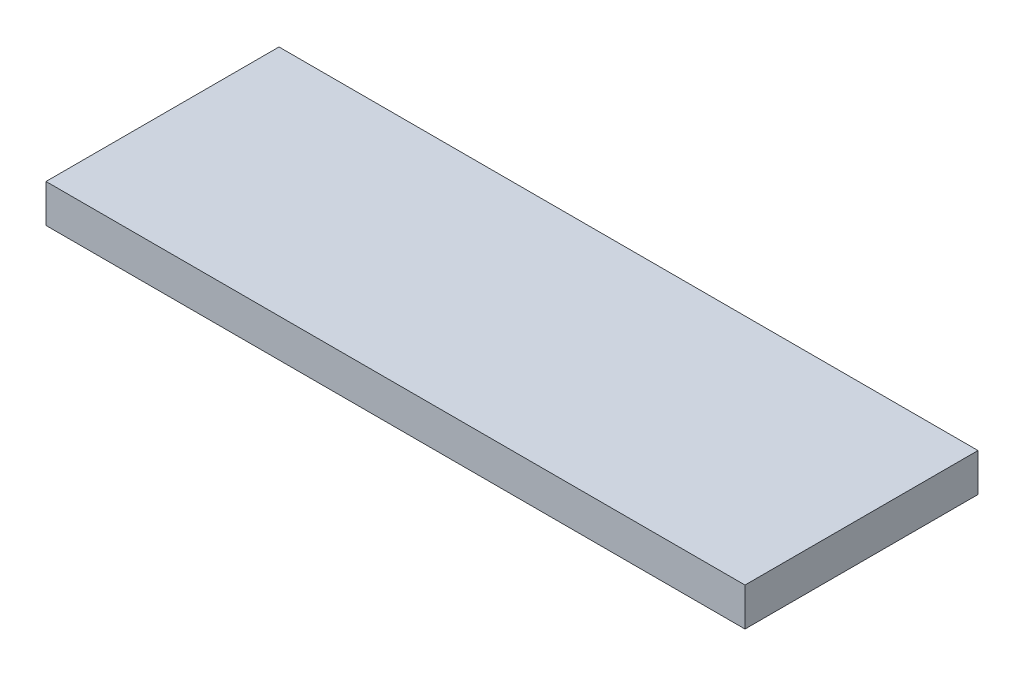
ISO-10303-21;
HEADER;
FILE_DESCRIPTION(('STEP AP214'),'2;1');
FILE_NAME('part.step','',(''),(''),'','','');
FILE_SCHEMA(('AUTOMOTIVE_DESIGN { 1 0 10303 214 1 1 1 1 }'));
ENDSEC;
DATA;
#1=APPLICATION_CONTEXT('core data for automotive mechanical design processes');
#2=APPLICATION_PROTOCOL_DEFINITION('international standard','automotive_design',2000,#1);
#3=PRODUCT_CONTEXT('',#1,'mechanical');
#4=PRODUCT('Part','Part','',(#3));
#5=PRODUCT_RELATED_PRODUCT_CATEGORY('part','',(#4));
#6=PRODUCT_DEFINITION_FORMATION('','',#4);
#7=PRODUCT_DEFINITION_CONTEXT('part definition',#1,'design');
#8=PRODUCT_DEFINITION('design','',#6,#7);
#9=PRODUCT_DEFINITION_SHAPE('','',#8);
#10=(LENGTH_UNIT() NAMED_UNIT(*) SI_UNIT(.MILLI.,.METRE.));
#11=(NAMED_UNIT(*) PLANE_ANGLE_UNIT() SI_UNIT($,.RADIAN.));
#12=(NAMED_UNIT(*) SI_UNIT($,.STERADIAN.) SOLID_ANGLE_UNIT());
#13=UNCERTAINTY_MEASURE_WITH_UNIT(LENGTH_MEASURE(1.E-05),#10,'distance_accuracy_value','');
#14=(GEOMETRIC_REPRESENTATION_CONTEXT(3) GLOBAL_UNCERTAINTY_ASSIGNED_CONTEXT((#13)) GLOBAL_UNIT_ASSIGNED_CONTEXT((#10,
#11,#12)) REPRESENTATION_CONTEXT('',''));
#15=CARTESIAN_POINT('',(0.,0.,0.));
#16=DIRECTION('',(0.,0.,1.));
#17=DIRECTION('',(1.,0.,0.));
#18=AXIS2_PLACEMENT_3D('',#15,#16,#17);
#19=CARTESIAN_POINT('',(82.5,9.,-27.5));
#20=DIRECTION('',(-1.,0.,0.));
#21=DIRECTION('',(0.,0.,1.));
#22=AXIS2_PLACEMENT_3D('',#19,#20,#21);
#23=PLANE('',#22);
#24=DIRECTION('',(0.,0.,-1.));
#25=VECTOR('',#24,1.);
#26=CARTESIAN_POINT('',(82.5,0.,-27.5));
#27=LINE('',#26,#25);
#28=CARTESIAN_POINT('',(82.5,0.,27.5));
#29=VERTEX_POINT('',#28);
#30=CARTESIAN_POINT('',(82.5,0.,-27.5));
#31=VERTEX_POINT('',#30);
#32=EDGE_CURVE('E95',#29,#31,#27,.T.);
#33=ORIENTED_EDGE('',*,*,#32,.T.);
#34=DIRECTION('',(0.,-1.,0.));
#35=VECTOR('',#34,1.);
#36=CARTESIAN_POINT('',(82.5,9.,-27.5));
#37=LINE('',#36,#35);
#38=CARTESIAN_POINT('',(82.5,9.,-27.5));
#39=VERTEX_POINT('',#38);
#40=EDGE_CURVE('E11',#39,#31,#37,.T.);
#41=ORIENTED_EDGE('',*,*,#40,.F.);
#42=DIRECTION('',(0.,0.,-1.));
#43=VECTOR('',#42,1.);
#44=CARTESIAN_POINT('',(82.5,9.,-27.5));
#45=LINE('',#44,#43);
#46=CARTESIAN_POINT('',(82.5,9.,27.5));
#47=VERTEX_POINT('',#46);
#48=EDGE_CURVE('E83',#47,#39,#45,.T.);
#49=ORIENTED_EDGE('',*,*,#48,.F.);
#50=DIRECTION('',(0.,-1.,0.));
#51=VECTOR('',#50,1.);
#52=CARTESIAN_POINT('',(82.5,9.,27.5));
#53=LINE('',#52,#51);
#54=EDGE_CURVE('E91',#47,#29,#53,.T.);
#55=ORIENTED_EDGE('',*,*,#54,.T.);
#56=EDGE_LOOP('',(#33,#41,#49,#55));
#57=FACE_BOUND('',#56,.T.);
#58=ADVANCED_FACE('F32',(#57),#23,.F.);
#59=CARTESIAN_POINT('',(-82.5,9.,-27.5));
#60=DIRECTION('',(0.,0.,1.));
#61=DIRECTION('',(1.,0.,0.));
#62=AXIS2_PLACEMENT_3D('',#59,#60,#61);
#63=PLANE('',#62);
#64=DIRECTION('',(-1.,0.,0.));
#65=VECTOR('',#64,1.);
#66=CARTESIAN_POINT('',(-82.5,0.,-27.5));
#67=LINE('',#66,#65);
#68=CARTESIAN_POINT('',(-82.5,0.,-27.5));
#69=VERTEX_POINT('',#68);
#70=EDGE_CURVE('E87',#31,#69,#67,.T.);
#71=ORIENTED_EDGE('',*,*,#70,.T.);
#72=DIRECTION('',(0.,-1.,0.));
#73=VECTOR('',#72,1.);
#74=CARTESIAN_POINT('',(-82.5,9.,-27.5));
#75=LINE('',#74,#73);
#76=CARTESIAN_POINT('',(-82.5,9.,-27.5));
#77=VERTEX_POINT('',#76);
#78=EDGE_CURVE('E40',#77,#69,#75,.T.);
#79=ORIENTED_EDGE('',*,*,#78,.F.);
#80=DIRECTION('',(-1.,0.,0.));
#81=VECTOR('',#80,1.);
#82=CARTESIAN_POINT('',(-82.5,9.,-27.5));
#83=LINE('',#82,#81);
#84=EDGE_CURVE('E78',#39,#77,#83,.T.);
#85=ORIENTED_EDGE('',*,*,#84,.F.);
#86=ORIENTED_EDGE('',*,*,#40,.T.);
#87=EDGE_LOOP('',(#71,#79,#85,#86));
#88=FACE_BOUND('',#87,.T.);
#89=ADVANCED_FACE('F86',(#88),#63,.F.);
#90=CARTESIAN_POINT('',(-82.5,9.,-27.5));
#91=DIRECTION('',(1.,0.,0.));
#92=DIRECTION('',(0.,0.,-1.));
#93=AXIS2_PLACEMENT_3D('',#90,#91,#92);
#94=PLANE('',#93);
#95=DIRECTION('',(0.,0.,1.));
#96=VECTOR('',#95,1.);
#97=CARTESIAN_POINT('',(-82.5,0.,-27.5));
#98=LINE('',#97,#96);
#99=CARTESIAN_POINT('',(-82.5,0.,27.5));
#100=VERTEX_POINT('',#99);
#101=EDGE_CURVE('E65',#69,#100,#98,.T.);
#102=ORIENTED_EDGE('',*,*,#101,.T.);
#103=DIRECTION('',(0.,-1.,0.));
#104=VECTOR('',#103,1.);
#105=CARTESIAN_POINT('',(-82.5,9.,27.5));
#106=LINE('',#105,#104);
#107=CARTESIAN_POINT('',(-82.5,9.,27.5));
#108=VERTEX_POINT('',#107);
#109=EDGE_CURVE('E88',#108,#100,#106,.T.);
#110=ORIENTED_EDGE('',*,*,#109,.F.);
#111=DIRECTION('',(0.,0.,1.));
#112=VECTOR('',#111,1.);
#113=CARTESIAN_POINT('',(-82.5,9.,-27.5));
#114=LINE('',#113,#112);
#115=EDGE_CURVE('E81',#77,#108,#114,.T.);
#116=ORIENTED_EDGE('',*,*,#115,.F.);
#117=ORIENTED_EDGE('',*,*,#78,.T.);
#118=EDGE_LOOP('',(#102,#110,#116,#117));
#119=FACE_BOUND('',#118,.T.);
#120=ADVANCED_FACE('F89',(#119),#94,.F.);
#121=CARTESIAN_POINT('',(-82.5,9.,27.5));
#122=DIRECTION('',(0.,0.,-1.));
#123=DIRECTION('',(-1.,0.,0.));
#124=AXIS2_PLACEMENT_3D('',#121,#122,#123);
#125=PLANE('',#124);
#126=DIRECTION('',(1.,0.,0.));
#127=VECTOR('',#126,1.);
#128=CARTESIAN_POINT('',(-82.5,0.,27.5));
#129=LINE('',#128,#127);
#130=EDGE_CURVE('E71',#100,#29,#129,.T.);
#131=ORIENTED_EDGE('',*,*,#130,.T.);
#132=ORIENTED_EDGE('',*,*,#54,.F.);
#133=DIRECTION('',(1.,0.,0.));
#134=VECTOR('',#133,1.);
#135=CARTESIAN_POINT('',(-82.5,9.,27.5));
#136=LINE('',#135,#134);
#137=EDGE_CURVE('E48',#108,#47,#136,.T.);
#138=ORIENTED_EDGE('',*,*,#137,.F.);
#139=ORIENTED_EDGE('',*,*,#109,.T.);
#140=EDGE_LOOP('',(#131,#132,#138,#139));
#141=FACE_BOUND('',#140,.T.);
#142=ADVANCED_FACE('F102',(#141),#125,.F.);
#143=CARTESIAN_POINT('',(0.,9.,0.));
#144=DIRECTION('',(0.,1.,0.));
#145=DIRECTION('',(0.,0.,1.));
#146=AXIS2_PLACEMENT_3D('',#143,#144,#145);
#147=PLANE('',#146);
#148=ORIENTED_EDGE('',*,*,#48,.T.);
#149=ORIENTED_EDGE('',*,*,#84,.T.);
#150=ORIENTED_EDGE('',*,*,#115,.T.);
#151=ORIENTED_EDGE('',*,*,#137,.T.);
#152=EDGE_LOOP('',(#148,#149,#150,#151));
#153=FACE_BOUND('',#152,.T.);
#154=ADVANCED_FACE('F79',(#153),#147,.T.);
#155=CARTESIAN_POINT('',(0.,0.,0.));
#156=DIRECTION('',(0.,1.,0.));
#157=DIRECTION('',(0.,0.,1.));
#158=AXIS2_PLACEMENT_3D('',#155,#156,#157);
#159=PLANE('',#158);
#160=ORIENTED_EDGE('',*,*,#32,.F.);
#161=ORIENTED_EDGE('',*,*,#130,.F.);
#162=ORIENTED_EDGE('',*,*,#101,.F.);
#163=ORIENTED_EDGE('',*,*,#70,.F.);
#164=EDGE_LOOP('',(#160,#161,#162,#163));
#165=FACE_BOUND('',#164,.T.);
#166=ADVANCED_FACE('F105',(#165),#159,.F.);
#167=CLOSED_SHELL('',(#58,#89,#120,#142,#154,#166));
#168=MANIFOLD_SOLID_BREP('B2',#167);
#169=ADVANCED_BREP_SHAPE_REPRESENTATION('',(#18,#168),#14);
#170=SHAPE_DEFINITION_REPRESENTATION(#9,#169);
ENDSEC;
END-ISO-10303-21;
